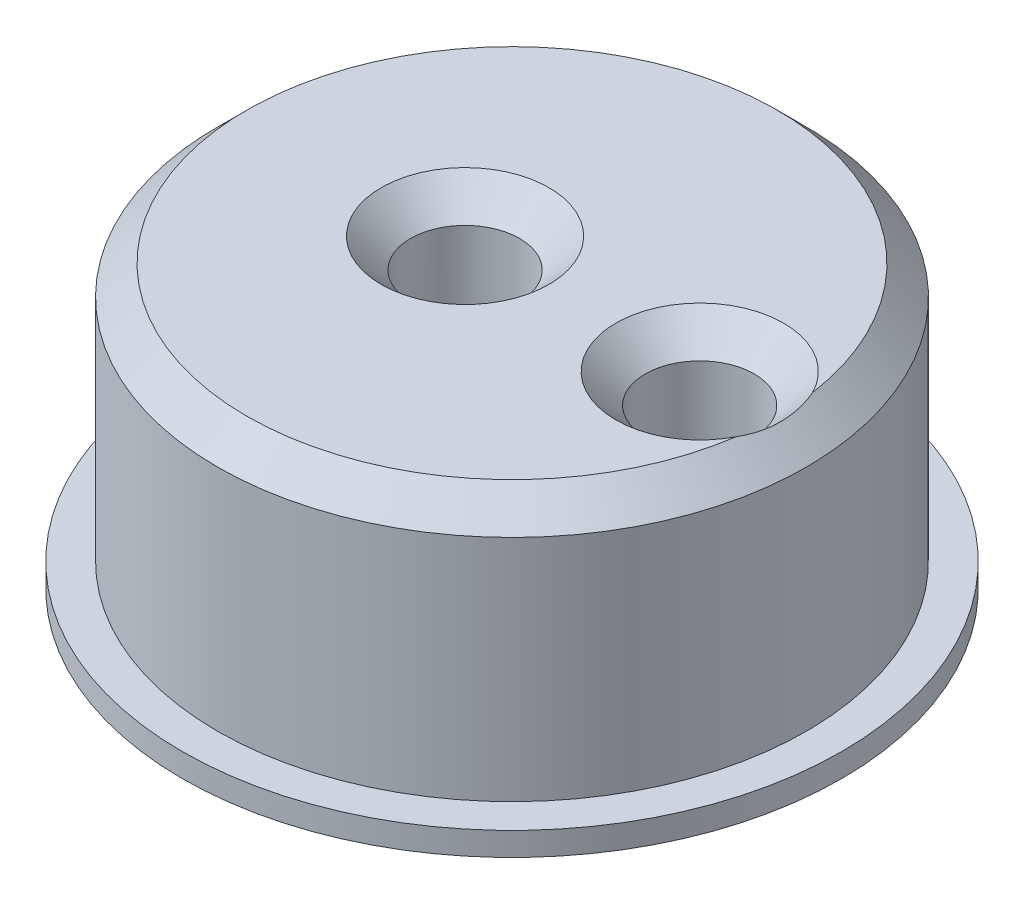
ISO-10303-21;
HEADER;
FILE_DESCRIPTION(('STEP AP214'),'2;1');
FILE_NAME('part.step','',(''),(''),'','','');
FILE_SCHEMA(('AUTOMOTIVE_DESIGN { 1 0 10303 214 1 1 1 1 }'));
ENDSEC;
DATA;
#1=APPLICATION_CONTEXT('core data for automotive mechanical design processes');
#2=APPLICATION_PROTOCOL_DEFINITION('international standard','automotive_design',2000,#1);
#3=PRODUCT_CONTEXT('',#1,'mechanical');
#4=PRODUCT('Part','Part','',(#3));
#5=PRODUCT_RELATED_PRODUCT_CATEGORY('part','',(#4));
#6=PRODUCT_DEFINITION_FORMATION('','',#4);
#7=PRODUCT_DEFINITION_CONTEXT('part definition',#1,'design');
#8=PRODUCT_DEFINITION('design','',#6,#7);
#9=PRODUCT_DEFINITION_SHAPE('','',#8);
#10=(LENGTH_UNIT() NAMED_UNIT(*) SI_UNIT(.MILLI.,.METRE.));
#11=(NAMED_UNIT(*) PLANE_ANGLE_UNIT() SI_UNIT($,.RADIAN.));
#12=(NAMED_UNIT(*) SI_UNIT($,.STERADIAN.) SOLID_ANGLE_UNIT());
#13=UNCERTAINTY_MEASURE_WITH_UNIT(LENGTH_MEASURE(1.E-05),#10,'distance_accuracy_value','');
#14=(GEOMETRIC_REPRESENTATION_CONTEXT(3) GLOBAL_UNCERTAINTY_ASSIGNED_CONTEXT((#13)) GLOBAL_UNIT_ASSIGNED_CONTEXT((#10,
#11,#12)) REPRESENTATION_CONTEXT('',''));
#15=CARTESIAN_POINT('',(0.,0.,0.));
#16=DIRECTION('',(0.,0.,1.));
#17=DIRECTION('',(1.,0.,0.));
#18=AXIS2_PLACEMENT_3D('',#15,#16,#17);
#19=CARTESIAN_POINT('',(0.,4.4,0.));
#20=DIRECTION('',(0.,1.,0.));
#21=DIRECTION('',(0.,0.,1.));
#22=AXIS2_PLACEMENT_3D('',#19,#20,#21);
#23=PLANE('',#22);
#24=CARTESIAN_POINT('',(-0.8,4.4,0.));
#25=DIRECTION('',(0.,1.,0.));
#26=DIRECTION('',(0.,0.,1.));
#27=AXIS2_PLACEMENT_3D('',#24,#25,#26);
#28=CIRCLE('',#27,1.43000000000001);
#29=CARTESIAN_POINT('',(-0.8,4.4,1.43000000000001));
#30=VERTEX_POINT('',#29);
#31=EDGE_CURVE('E52',#30,#30,#28,.F.);
#32=ORIENTED_EDGE('',*,*,#31,.T.);
#33=EDGE_LOOP('',(#32));
#34=FACE_BOUND('',#33,.T.);
#35=CARTESIAN_POINT('',(3.2,4.4,0.));
#36=DIRECTION('',(0.,1.,0.));
#37=DIRECTION('',(0.,0.,1.));
#38=AXIS2_PLACEMENT_3D('',#35,#36,#37);
#39=CIRCLE('',#38,1.43000000000001);
#40=CARTESIAN_POINT('',(3.2,4.4,1.43000000000001));
#41=VERTEX_POINT('',#40);
#42=CARTESIAN_POINT('',(4.472734375,4.4,-0.651956448463686));
#43=VERTEX_POINT('',#42);
#44=EDGE_CURVE('E71',#41,#43,#39,.F.);
#45=ORIENTED_EDGE('',*,*,#44,.T.);
#46=CARTESIAN_POINT('',(0.,4.4,0.));
#47=DIRECTION('',(0.,1.,0.));
#48=DIRECTION('',(0.,0.,1.));
#49=AXIS2_PLACEMENT_3D('',#46,#47,#48);
#50=CIRCLE('',#49,4.52);
#51=CARTESIAN_POINT('',(0.,4.4,4.52));
#52=VERTEX_POINT('',#51);
#53=EDGE_CURVE('E84',#43,#52,#50,.T.);
#54=ORIENTED_EDGE('',*,*,#53,.T.);
#55=CARTESIAN_POINT('',(0.,4.4,0.));
#56=DIRECTION('',(0.,1.,0.));
#57=DIRECTION('',(0.,0.,1.));
#58=AXIS2_PLACEMENT_3D('',#55,#56,#57);
#59=CIRCLE('',#58,4.52);
#60=CARTESIAN_POINT('',(4.472734375,4.4,0.651956448463686));
#61=VERTEX_POINT('',#60);
#62=EDGE_CURVE('E59',#52,#61,#59,.T.);
#63=ORIENTED_EDGE('',*,*,#62,.T.);
#64=CARTESIAN_POINT('',(3.2,4.4,0.));
#65=DIRECTION('',(0.,1.,0.));
#66=DIRECTION('',(0.,0.,1.));
#67=AXIS2_PLACEMENT_3D('',#64,#65,#66);
#68=CIRCLE('',#67,1.43000000000001);
#69=EDGE_CURVE('E69',#61,#41,#68,.F.);
#70=ORIENTED_EDGE('',*,*,#69,.T.);
#71=EDGE_LOOP('',(#45,#54,#63,#70));
#72=FACE_BOUND('',#71,.T.);
#73=ADVANCED_FACE('F37',(#34,#72),#23,.T.);
#74=CARTESIAN_POINT('',(0.,4.4,0.));
#75=DIRECTION('',(0.,-1.,0.));
#76=DIRECTION('',(0.,0.,-1.));
#77=AXIS2_PLACEMENT_3D('',#74,#75,#76);
#78=CYLINDRICAL_SURFACE('',#77,5.02);
#79=CARTESIAN_POINT('',(0.,3.9,0.));
#80=DIRECTION('',(0.,1.,0.));
#81=DIRECTION('',(0.,0.,1.));
#82=AXIS2_PLACEMENT_3D('',#79,#80,#81);
#83=CIRCLE('',#82,5.02);
#84=CARTESIAN_POINT('',(0.,3.9,5.02));
#85=VERTEX_POINT('',#84);
#86=EDGE_CURVE('E11',#85,#85,#83,.F.);
#87=ORIENTED_EDGE('',*,*,#86,.T.);
#88=EDGE_LOOP('',(#87));
#89=FACE_BOUND('',#88,.T.);
#90=CARTESIAN_POINT('',(0.,0.,0.));
#91=DIRECTION('',(0.,1.,0.));
#92=DIRECTION('',(0.,0.,1.));
#93=AXIS2_PLACEMENT_3D('',#90,#91,#92);
#94=CIRCLE('',#93,5.02);
#95=CARTESIAN_POINT('',(0.,0.,5.02));
#96=VERTEX_POINT('',#95);
#97=EDGE_CURVE('E111',#96,#96,#94,.T.);
#98=ORIENTED_EDGE('',*,*,#97,.T.);
#99=EDGE_LOOP('',(#98));
#100=FACE_BOUND('',#99,.T.);
#101=ADVANCED_FACE('F142',(#89,#100),#78,.T.);
#102=CARTESIAN_POINT('',(3.2,4.4,0.));
#103=DIRECTION('',(0.,-1.,0.));
#104=DIRECTION('',(0.,0.,-1.));
#105=AXIS2_PLACEMENT_3D('',#102,#103,#104);
#106=CYLINDRICAL_SURFACE('',#105,0.930000000000001);
#107=CARTESIAN_POINT('',(3.2,0.100000000000001,0.));
#108=DIRECTION('',(0.,-1.,0.));
#109=DIRECTION('',(0.,0.,-1.));
#110=AXIS2_PLACEMENT_3D('',#107,#108,#109);
#111=CIRCLE('',#110,0.930000000000001);
#112=CARTESIAN_POINT('',(3.2,0.100000000000001,-0.930000000000001));
#113=VERTEX_POINT('',#112);
#114=EDGE_CURVE('E105',#113,#113,#111,.T.);
#115=ORIENTED_EDGE('',*,*,#114,.T.);
#116=EDGE_LOOP('',(#115));
#117=FACE_BOUND('',#116,.T.);
#118=CARTESIAN_POINT('',(3.2,3.9,0.));
#119=DIRECTION('',(0.,1.,0.));
#120=DIRECTION('',(0.,0.,1.));
#121=AXIS2_PLACEMENT_3D('',#118,#119,#120);
#122=CIRCLE('',#121,0.930000000000001);
#123=CARTESIAN_POINT('',(3.2,3.9,0.930000000000001));
#124=VERTEX_POINT('',#123);
#125=EDGE_CURVE('E108',#124,#124,#122,.T.);
#126=ORIENTED_EDGE('',*,*,#125,.T.);
#127=EDGE_LOOP('',(#126));
#128=FACE_BOUND('',#127,.T.);
#129=ADVANCED_FACE('F147',(#117,#128),#106,.F.);
#130=CARTESIAN_POINT('',(-0.8,4.4,0.));
#131=DIRECTION('',(0.,-1.,0.));
#132=DIRECTION('',(0.,0.,-1.));
#133=AXIS2_PLACEMENT_3D('',#130,#131,#132);
#134=CYLINDRICAL_SURFACE('',#133,0.93);
#135=CARTESIAN_POINT('',(-0.8,0.100000000000002,0.));
#136=DIRECTION('',(0.,-1.,0.));
#137=DIRECTION('',(0.,0.,-1.));
#138=AXIS2_PLACEMENT_3D('',#135,#136,#137);
#139=CIRCLE('',#138,0.93);
#140=CARTESIAN_POINT('',(-0.8,0.100000000000002,-0.93));
#141=VERTEX_POINT('',#140);
#142=EDGE_CURVE('E76',#141,#141,#139,.T.);
#143=ORIENTED_EDGE('',*,*,#142,.T.);
#144=EDGE_LOOP('',(#143));
#145=FACE_BOUND('',#144,.T.);
#146=CARTESIAN_POINT('',(-0.8,3.9,0.));
#147=DIRECTION('',(0.,1.,0.));
#148=DIRECTION('',(0.,0.,1.));
#149=AXIS2_PLACEMENT_3D('',#146,#147,#148);
#150=CIRCLE('',#149,0.93);
#151=CARTESIAN_POINT('',(-0.8,3.9,0.930000000000001));
#152=VERTEX_POINT('',#151);
#153=EDGE_CURVE('E79',#152,#152,#150,.T.);
#154=ORIENTED_EDGE('',*,*,#153,.T.);
#155=EDGE_LOOP('',(#154));
#156=FACE_BOUND('',#155,.T.);
#157=ADVANCED_FACE('F137',(#145,#156),#134,.F.);
#158=CARTESIAN_POINT('',(0.,-0.4,0.));
#159=DIRECTION('',(0.,-1.,0.));
#160=DIRECTION('',(0.,0.,-1.));
#161=AXIS2_PLACEMENT_3D('',#158,#159,#160);
#162=PLANE('',#161);
#163=CARTESIAN_POINT('',(3.2,-0.4,0.));
#164=DIRECTION('',(0.,-1.,0.));
#165=DIRECTION('',(0.,0.,-1.));
#166=AXIS2_PLACEMENT_3D('',#163,#164,#165);
#167=CIRCLE('',#166,1.43);
#168=CARTESIAN_POINT('',(3.2,-0.4,-1.43));
#169=VERTEX_POINT('',#168);
#170=EDGE_CURVE('E98',#169,#169,#167,.F.);
#171=ORIENTED_EDGE('',*,*,#170,.T.);
#172=EDGE_LOOP('',(#171));
#173=FACE_BOUND('',#172,.T.);
#174=CARTESIAN_POINT('',(-0.8,-0.4,0.));
#175=DIRECTION('',(0.,-1.,0.));
#176=DIRECTION('',(0.,0.,-1.));
#177=AXIS2_PLACEMENT_3D('',#174,#175,#176);
#178=CIRCLE('',#177,1.43);
#179=CARTESIAN_POINT('',(-0.8,-0.4,-1.43));
#180=VERTEX_POINT('',#179);
#181=EDGE_CURVE('E100',#180,#180,#178,.F.);
#182=ORIENTED_EDGE('',*,*,#181,.T.);
#183=EDGE_LOOP('',(#182));
#184=FACE_BOUND('',#183,.T.);
#185=CARTESIAN_POINT('',(0.,-0.4,0.));
#186=DIRECTION('',(0.,-1.,0.));
#187=DIRECTION('',(0.,0.,-1.));
#188=AXIS2_PLACEMENT_3D('',#185,#186,#187);
#189=CIRCLE('',#188,5.62);
#190=CARTESIAN_POINT('',(0.,-0.4,-5.62));
#191=VERTEX_POINT('',#190);
#192=EDGE_CURVE('E114',#191,#191,#189,.T.);
#193=ORIENTED_EDGE('',*,*,#192,.T.);
#194=EDGE_LOOP('',(#193));
#195=FACE_BOUND('',#194,.T.);
#196=ADVANCED_FACE('F121',(#173,#184,#195),#162,.T.);
#197=CARTESIAN_POINT('',(0.,0.,0.));
#198=DIRECTION('',(0.,-1.,0.));
#199=DIRECTION('',(0.,0.,-1.));
#200=AXIS2_PLACEMENT_3D('',#197,#198,#199);
#201=PLANE('',#200);
#202=ORIENTED_EDGE('',*,*,#97,.F.);
#203=EDGE_LOOP('',(#202));
#204=FACE_BOUND('',#203,.T.);
#205=CARTESIAN_POINT('',(0.,0.,0.));
#206=DIRECTION('',(0.,-1.,0.));
#207=DIRECTION('',(0.,0.,-1.));
#208=AXIS2_PLACEMENT_3D('',#205,#206,#207);
#209=CIRCLE('',#208,5.62);
#210=CARTESIAN_POINT('',(0.,0.,-5.62));
#211=VERTEX_POINT('',#210);
#212=EDGE_CURVE('E115',#211,#211,#209,.T.);
#213=ORIENTED_EDGE('',*,*,#212,.F.);
#214=EDGE_LOOP('',(#213));
#215=FACE_BOUND('',#214,.T.);
#216=ADVANCED_FACE('F127',(#204,#215),#201,.F.);
#217=CARTESIAN_POINT('',(0.,-0.4,0.));
#218=DIRECTION('',(0.,1.,0.));
#219=DIRECTION('',(0.,0.,1.));
#220=AXIS2_PLACEMENT_3D('',#217,#218,#219);
#221=CYLINDRICAL_SURFACE('',#220,5.62);
#222=ORIENTED_EDGE('',*,*,#192,.F.);
#223=EDGE_LOOP('',(#222));
#224=FACE_BOUND('',#223,.T.);
#225=ORIENTED_EDGE('',*,*,#212,.T.);
#226=EDGE_LOOP('',(#225));
#227=FACE_BOUND('',#226,.T.);
#228=ADVANCED_FACE('F123',(#224,#227),#221,.T.);
#229=CARTESIAN_POINT('',(3.2,0.100000000000001,0.));
#230=DIRECTION('',(0.,-1.,0.));
#231=DIRECTION('',(0.,0.,-1.));
#232=AXIS2_PLACEMENT_3D('',#229,#230,#231);
#233=CONICAL_SURFACE('',#232,0.930000000000001,0.785398163397449);
#234=ORIENTED_EDGE('',*,*,#170,.F.);
#235=EDGE_LOOP('',(#234));
#236=FACE_BOUND('',#235,.T.);
#237=ORIENTED_EDGE('',*,*,#114,.F.);
#238=EDGE_LOOP('',(#237));
#239=FACE_BOUND('',#238,.T.);
#240=ADVANCED_FACE('F126',(#236,#239),#233,.F.);
#241=CARTESIAN_POINT('',(-0.8,0.100000000000002,0.));
#242=DIRECTION('',(0.,-1.,0.));
#243=DIRECTION('',(0.,0.,-1.));
#244=AXIS2_PLACEMENT_3D('',#241,#242,#243);
#245=CONICAL_SURFACE('',#244,0.93,0.785398163397448);
#246=ORIENTED_EDGE('',*,*,#181,.F.);
#247=EDGE_LOOP('',(#246));
#248=FACE_BOUND('',#247,.T.);
#249=ORIENTED_EDGE('',*,*,#142,.F.);
#250=EDGE_LOOP('',(#249));
#251=FACE_BOUND('',#250,.T.);
#252=ADVANCED_FACE('F93',(#248,#251),#245,.F.);
#253=CARTESIAN_POINT('',(-0.8,3.9,0.));
#254=DIRECTION('',(0.,1.,0.));
#255=DIRECTION('',(0.,0.,1.));
#256=AXIS2_PLACEMENT_3D('',#253,#254,#255);
#257=CONICAL_SURFACE('',#256,0.93,0.78539816339745);
#258=ORIENTED_EDGE('',*,*,#31,.F.);
#259=EDGE_LOOP('',(#258));
#260=FACE_BOUND('',#259,.T.);
#261=ORIENTED_EDGE('',*,*,#153,.F.);
#262=EDGE_LOOP('',(#261));
#263=FACE_BOUND('',#262,.T.);
#264=ADVANCED_FACE('F90',(#260,#263),#257,.F.);
#265=CARTESIAN_POINT('',(3.2,3.9,0.));
#266=DIRECTION('',(0.,1.,0.));
#267=DIRECTION('',(0.,0.,1.));
#268=AXIS2_PLACEMENT_3D('',#265,#266,#267);
#269=CONICAL_SURFACE('',#268,0.930000000000001,0.78539816339745);
#270=ORIENTED_EDGE('',*,*,#125,.F.);
#271=EDGE_LOOP('',(#270));
#272=FACE_BOUND('',#271,.T.);
#273=CARTESIAN_POINT('',(4.4723625,4.4002,-0.653119980243878));
#274=CARTESIAN_POINT('',(4.489024237789,4.39123906532963,-0.601076350280926));
#275=CARTESIAN_POINT('',(4.50378227601186,4.38330196917559,-0.548234229274885));
#276=CARTESIAN_POINT('',(4.52929857681252,4.36957891673543,-0.441303083235691));
#277=CARTESIAN_POINT('',(4.54005557364085,4.36379364118854,-0.387213669352526));
#278=CARTESIAN_POINT('',(4.55710976794459,4.35462163750812,-0.279789373620754));
#279=CARTESIAN_POINT('',(4.56352984279524,4.35116882406755,-0.226479736011534));
#280=CARTESIAN_POINT('',(4.57230555601956,4.34644911270473,-0.119441290026147));
#281=CARTESIAN_POINT('',(4.57466203891882,4.34518176058381,-0.0657125710787544));
#282=CARTESIAN_POINT('',(4.57528114932989,4.34484879363529,0.0437078329332983));
#283=CARTESIAN_POINT('',(4.57339365782936,4.3458639150811,0.0994006923127365));
#284=CARTESIAN_POINT('',(4.56524903822296,4.3502442147737,0.210386666634112));
#285=CARTESIAN_POINT('',(4.55899069059275,4.35361004889916,0.265679665658648));
#286=CARTESIAN_POINT('',(4.54194883076703,4.3627754189192,0.377161532872677));
#287=CARTESIAN_POINT('',(4.53102823513824,4.36864868035187,0.433323284333676));
#288=CARTESIAN_POINT('',(4.50487455009248,4.38271452764272,0.544316518002654));
#289=CARTESIAN_POINT('',(4.4896430685031,4.39090624878689,0.599148487915808));
#290=CARTESIAN_POINT('',(4.4723625,4.4002,0.65311998024388));
#291=B_SPLINE_CURVE_WITH_KNOTS('',3,(#273,#274,#275,#276,#277,#278,#279,#280,#281,#282,#283,
#284,#285,#286,#287,#288,#289,#290),.UNSPECIFIED.,.F.,.F.,(4,2,2,2,2,2,2,2,4),(0.,
0.166097689011147,0.332247879255909,0.493467323409078,0.6546532577105,0.821630022324873,
0.988653394197814,1.16096835929309,1.33321914071863),.UNSPECIFIED.);
#292=EDGE_CURVE('E42',#43,#61,#291,.T.);
#293=ORIENTED_EDGE('',*,*,#292,.F.);
#294=ORIENTED_EDGE('',*,*,#44,.F.);
#295=ORIENTED_EDGE('',*,*,#69,.F.);
#296=EDGE_LOOP('',(#293,#294,#295));
#297=FACE_BOUND('',#296,.T.);
#298=ADVANCED_FACE('F75',(#272,#297),#269,.F.);
#299=CARTESIAN_POINT('',(0.,4.4,0.));
#300=DIRECTION('',(0.,-1.,0.));
#301=DIRECTION('',(0.,0.,-1.));
#302=AXIS2_PLACEMENT_3D('',#299,#300,#301);
#303=CONICAL_SURFACE('',#302,4.52,0.785398163397448);
#304=ORIENTED_EDGE('',*,*,#86,.F.);
#305=EDGE_LOOP('',(#304));
#306=FACE_BOUND('',#305,.T.);
#307=ORIENTED_EDGE('',*,*,#53,.F.);
#308=ORIENTED_EDGE('',*,*,#292,.T.);
#309=ORIENTED_EDGE('',*,*,#62,.F.);
#310=EDGE_LOOP('',(#307,#308,#309));
#311=FACE_BOUND('',#310,.T.);
#312=ADVANCED_FACE('F40',(#306,#311),#303,.T.);
#313=CLOSED_SHELL('',(#73,#101,#129,#157,#196,#216,#228,#240,#252,#264,#298,#312));
#314=MANIFOLD_SOLID_BREP('B2',#313);
#315=ADVANCED_BREP_SHAPE_REPRESENTATION('',(#18,#314),#14);
#316=SHAPE_DEFINITION_REPRESENTATION(#9,#315);
ENDSEC;
END-ISO-10303-21;
